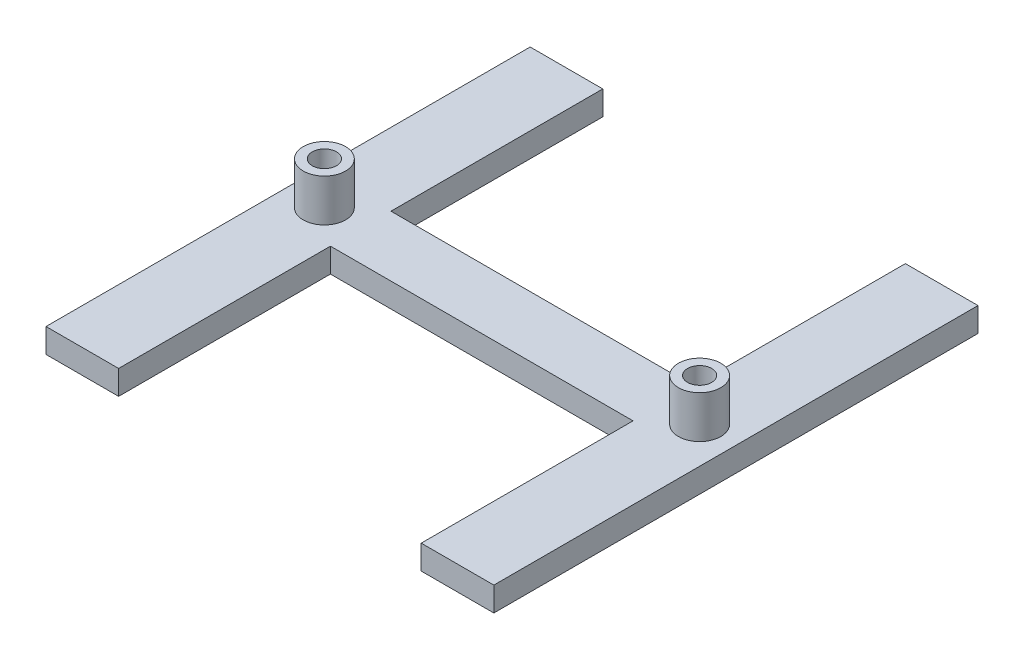
ISO-10303-21;
HEADER;
FILE_DESCRIPTION(('STEP AP214'),'2;1');
FILE_NAME('part.step','',(''),(''),'','','');
FILE_SCHEMA(('AUTOMOTIVE_DESIGN { 1 0 10303 214 1 1 1 1 }'));
ENDSEC;
DATA;
#1=APPLICATION_CONTEXT('core data for automotive mechanical design processes');
#2=APPLICATION_PROTOCOL_DEFINITION('international standard','automotive_design',2000,#1);
#3=PRODUCT_CONTEXT('',#1,'mechanical');
#4=PRODUCT('Part','Part','',(#3));
#5=PRODUCT_RELATED_PRODUCT_CATEGORY('part','',(#4));
#6=PRODUCT_DEFINITION_FORMATION('','',#4);
#7=PRODUCT_DEFINITION_CONTEXT('part definition',#1,'design');
#8=PRODUCT_DEFINITION('design','',#6,#7);
#9=PRODUCT_DEFINITION_SHAPE('','',#8);
#10=(LENGTH_UNIT() NAMED_UNIT(*) SI_UNIT(.MILLI.,.METRE.));
#11=(NAMED_UNIT(*) PLANE_ANGLE_UNIT() SI_UNIT($,.RADIAN.));
#12=(NAMED_UNIT(*) SI_UNIT($,.STERADIAN.) SOLID_ANGLE_UNIT());
#13=UNCERTAINTY_MEASURE_WITH_UNIT(LENGTH_MEASURE(1.E-05),#10,'distance_accuracy_value','');
#14=(GEOMETRIC_REPRESENTATION_CONTEXT(3) GLOBAL_UNCERTAINTY_ASSIGNED_CONTEXT((#13)) GLOBAL_UNIT_ASSIGNED_CONTEXT((#10,
#11,#12)) REPRESENTATION_CONTEXT('',''));
#15=CARTESIAN_POINT('',(0.,0.,0.));
#16=DIRECTION('',(0.,0.,1.));
#17=DIRECTION('',(1.,0.,0.));
#18=AXIS2_PLACEMENT_3D('',#15,#16,#17);
#19=CARTESIAN_POINT('',(-69.7107995038457,4.,0.));
#20=DIRECTION('',(1.,0.,0.));
#21=DIRECTION('',(0.,0.,-1.));
#22=AXIS2_PLACEMENT_3D('',#19,#20,#21);
#23=PLANE('',#22);
#24=DIRECTION('',(0.,0.,1.));
#25=VECTOR('',#24,1.);
#26=CARTESIAN_POINT('',(-69.7107995038457,0.,0.));
#27=LINE('',#26,#25);
#28=CARTESIAN_POINT('',(-69.7107995038457,0.,-123.763400912436));
#29=VERTEX_POINT('',#28);
#30=CARTESIAN_POINT('',(-69.7107995038457,0.,-88.7643319684298));
#31=VERTEX_POINT('',#30);
#32=EDGE_CURVE('E194',#29,#31,#27,.T.);
#33=ORIENTED_EDGE('',*,*,#32,.F.);
#34=DIRECTION('',(0.,-1.,0.));
#35=VECTOR('',#34,1.);
#36=CARTESIAN_POINT('',(-69.7107995038457,4.,-123.763400912436));
#37=LINE('',#36,#35);
#38=CARTESIAN_POINT('',(-69.7107995038457,4.,-123.763400912436));
#39=VERTEX_POINT('',#38);
#40=EDGE_CURVE('E112',#39,#29,#37,.T.);
#41=ORIENTED_EDGE('',*,*,#40,.F.);
#42=DIRECTION('',(0.,0.,1.));
#43=VECTOR('',#42,1.);
#44=CARTESIAN_POINT('',(-69.7107995038457,4.,0.));
#45=LINE('',#44,#43);
#46=CARTESIAN_POINT('',(-69.7107995038457,4.,-88.7643319684298));
#47=VERTEX_POINT('',#46);
#48=EDGE_CURVE('E179',#39,#47,#45,.T.);
#49=ORIENTED_EDGE('',*,*,#48,.T.);
#50=DIRECTION('',(0.,-1.,0.));
#51=VECTOR('',#50,1.);
#52=CARTESIAN_POINT('',(-69.7107995038457,4.,-88.7643319684298));
#53=LINE('',#52,#51);
#54=EDGE_CURVE('E64',#47,#31,#53,.T.);
#55=ORIENTED_EDGE('',*,*,#54,.T.);
#56=EDGE_LOOP('',(#33,#41,#49,#55));
#57=FACE_BOUND('',#56,.T.);
#58=ADVANCED_FACE('F47',(#57),#23,.T.);
#59=CARTESIAN_POINT('',(0.,4.,-123.763400912436));
#60=DIRECTION('',(0.,0.,1.));
#61=DIRECTION('',(1.,0.,0.));
#62=AXIS2_PLACEMENT_3D('',#59,#60,#61);
#63=PLANE('',#62);
#64=DIRECTION('',(-1.,0.,0.));
#65=VECTOR('',#64,1.);
#66=CARTESIAN_POINT('',(0.,0.,-123.763400912436));
#67=LINE('',#66,#65);
#68=CARTESIAN_POINT('',(-81.7107995038457,0.,-123.763400912436));
#69=VERTEX_POINT('',#68);
#70=EDGE_CURVE('E484',#29,#69,#67,.T.);
#71=ORIENTED_EDGE('',*,*,#70,.T.);
#72=DIRECTION('',(0.,-1.,0.));
#73=VECTOR('',#72,1.);
#74=CARTESIAN_POINT('',(-81.7107995038457,4.,-123.763400912436));
#75=LINE('',#74,#73);
#76=CARTESIAN_POINT('',(-81.7107995038457,4.,-123.763400912436));
#77=VERTEX_POINT('',#76);
#78=EDGE_CURVE('E301',#77,#69,#75,.T.);
#79=ORIENTED_EDGE('',*,*,#78,.F.);
#80=DIRECTION('',(-1.,0.,0.));
#81=VECTOR('',#80,1.);
#82=CARTESIAN_POINT('',(0.,4.,-123.763400912436));
#83=LINE('',#82,#81);
#84=EDGE_CURVE('E184',#39,#77,#83,.T.);
#85=ORIENTED_EDGE('',*,*,#84,.F.);
#86=ORIENTED_EDGE('',*,*,#40,.T.);
#87=EDGE_LOOP('',(#71,#79,#85,#86));
#88=FACE_BOUND('',#87,.T.);
#89=ADVANCED_FACE('F49',(#88),#63,.F.);
#90=CARTESIAN_POINT('',(-81.7107995038456,4.,0.));
#91=DIRECTION('',(1.,0.,0.));
#92=DIRECTION('',(0.,0.,-1.));
#93=AXIS2_PLACEMENT_3D('',#90,#91,#92);
#94=PLANE('',#93);
#95=DIRECTION('',(0.,0.,1.));
#96=VECTOR('',#95,1.);
#97=CARTESIAN_POINT('',(-81.7107995038456,0.,0.));
#98=LINE('',#97,#96);
#99=CARTESIAN_POINT('',(-81.7107995038457,0.,-43.7634009124366));
#100=VERTEX_POINT('',#99);
#101=EDGE_CURVE('E479',#69,#100,#98,.T.);
#102=ORIENTED_EDGE('',*,*,#101,.T.);
#103=DIRECTION('',(0.,-1.,0.));
#104=VECTOR('',#103,1.);
#105=CARTESIAN_POINT('',(-81.7107995038457,4.,-43.7634009124366));
#106=LINE('',#105,#104);
#107=CARTESIAN_POINT('',(-81.7107995038457,4.,-43.7634009124366));
#108=VERTEX_POINT('',#107);
#109=EDGE_CURVE('E298',#108,#100,#106,.T.);
#110=ORIENTED_EDGE('',*,*,#109,.F.);
#111=DIRECTION('',(0.,0.,1.));
#112=VECTOR('',#111,1.);
#113=CARTESIAN_POINT('',(-81.7107995038456,4.,0.));
#114=LINE('',#113,#112);
#115=EDGE_CURVE('E182',#77,#108,#114,.T.);
#116=ORIENTED_EDGE('',*,*,#115,.F.);
#117=ORIENTED_EDGE('',*,*,#78,.T.);
#118=EDGE_LOOP('',(#102,#110,#116,#117));
#119=FACE_BOUND('',#118,.T.);
#120=ADVANCED_FACE('F239',(#119),#94,.F.);
#121=CARTESIAN_POINT('',(0.,4.,-43.7634009124366));
#122=DIRECTION('',(0.,0.,-1.));
#123=DIRECTION('',(-1.,0.,0.));
#124=AXIS2_PLACEMENT_3D('',#121,#122,#123);
#125=PLANE('',#124);
#126=DIRECTION('',(1.,0.,0.));
#127=VECTOR('',#126,1.);
#128=CARTESIAN_POINT('',(0.,0.,-43.7634009124366));
#129=LINE('',#128,#127);
#130=CARTESIAN_POINT('',(-69.7107995038457,0.,-43.7634009124366));
#131=VERTEX_POINT('',#130);
#132=EDGE_CURVE('E265',#100,#131,#129,.T.);
#133=ORIENTED_EDGE('',*,*,#132,.T.);
#134=DIRECTION('',(0.,-1.,0.));
#135=VECTOR('',#134,1.);
#136=CARTESIAN_POINT('',(-69.7107995038457,4.,-43.7634009124366));
#137=LINE('',#136,#135);
#138=CARTESIAN_POINT('',(-69.7107995038457,4.,-43.7634009124366));
#139=VERTEX_POINT('',#138);
#140=EDGE_CURVE('E260',#139,#131,#137,.T.);
#141=ORIENTED_EDGE('',*,*,#140,.F.);
#142=DIRECTION('',(1.,0.,0.));
#143=VECTOR('',#142,1.);
#144=CARTESIAN_POINT('',(0.,4.,-43.7634009124366));
#145=LINE('',#144,#143);
#146=EDGE_CURVE('E177',#108,#139,#145,.T.);
#147=ORIENTED_EDGE('',*,*,#146,.F.);
#148=ORIENTED_EDGE('',*,*,#109,.T.);
#149=EDGE_LOOP('',(#133,#141,#147,#148));
#150=FACE_BOUND('',#149,.T.);
#151=ADVANCED_FACE('F245',(#150),#125,.F.);
#152=CARTESIAN_POINT('',(-69.7107995038457,0.,-78.7624698564434));
#153=VERTEX_POINT('',#152);
#154=EDGE_CURVE('E255',#153,#131,#27,.T.);
#155=ORIENTED_EDGE('',*,*,#154,.F.);
#156=DIRECTION('',(0.,-1.,0.));
#157=VECTOR('',#156,1.);
#158=CARTESIAN_POINT('',(-69.7107995038457,4.,-78.7624698564434));
#159=LINE('',#158,#157);
#160=CARTESIAN_POINT('',(-69.7107995038457,4.,-78.7624698564434));
#161=VERTEX_POINT('',#160);
#162=EDGE_CURVE('E257',#161,#153,#159,.T.);
#163=ORIENTED_EDGE('',*,*,#162,.F.);
#164=EDGE_CURVE('E174',#161,#139,#45,.T.);
#165=ORIENTED_EDGE('',*,*,#164,.T.);
#166=ORIENTED_EDGE('',*,*,#140,.T.);
#167=EDGE_LOOP('',(#155,#163,#165,#166));
#168=FACE_BOUND('',#167,.T.);
#169=ADVANCED_FACE('F235',(#168),#23,.T.);
#170=CARTESIAN_POINT('',(0.,4.,-78.7624698564434));
#171=DIRECTION('',(0.,0.,1.));
#172=DIRECTION('',(1.,0.,0.));
#173=AXIS2_PLACEMENT_3D('',#170,#171,#172);
#174=PLANE('',#173);
#175=DIRECTION('',(-1.,0.,0.));
#176=VECTOR('',#175,1.);
#177=CARTESIAN_POINT('',(0.,0.,-78.7624698564434));
#178=LINE('',#177,#176);
#179=CARTESIAN_POINT('',(-19.7107995038457,0.,-78.7624698564434));
#180=VERTEX_POINT('',#179);
#181=EDGE_CURVE('E264',#180,#153,#178,.T.);
#182=ORIENTED_EDGE('',*,*,#181,.F.);
#183=DIRECTION('',(0.,-1.,0.));
#184=VECTOR('',#183,1.);
#185=CARTESIAN_POINT('',(-19.7107995038457,4.,-78.7624698564434));
#186=LINE('',#185,#184);
#187=CARTESIAN_POINT('',(-19.7107995038457,4.,-78.7624698564434));
#188=VERTEX_POINT('',#187);
#189=EDGE_CURVE('E294',#188,#180,#186,.T.);
#190=ORIENTED_EDGE('',*,*,#189,.F.);
#191=DIRECTION('',(-1.,0.,0.));
#192=VECTOR('',#191,1.);
#193=CARTESIAN_POINT('',(0.,4.,-78.7624698564434));
#194=LINE('',#193,#192);
#195=EDGE_CURVE('E169',#188,#161,#194,.T.);
#196=ORIENTED_EDGE('',*,*,#195,.T.);
#197=ORIENTED_EDGE('',*,*,#162,.T.);
#198=EDGE_LOOP('',(#182,#190,#196,#197));
#199=FACE_BOUND('',#198,.T.);
#200=ADVANCED_FACE('F244',(#199),#174,.T.);
#201=CARTESIAN_POINT('',(-19.7107995038457,4.,0.));
#202=DIRECTION('',(1.,0.,0.));
#203=DIRECTION('',(0.,0.,-1.));
#204=AXIS2_PLACEMENT_3D('',#201,#202,#203);
#205=PLANE('',#204);
#206=DIRECTION('',(0.,0.,1.));
#207=VECTOR('',#206,1.);
#208=CARTESIAN_POINT('',(-19.7107995038457,0.,0.));
#209=LINE('',#208,#207);
#210=CARTESIAN_POINT('',(-19.7107995038457,0.,-43.7634009124366));
#211=VERTEX_POINT('',#210);
#212=EDGE_CURVE('E270',#180,#211,#209,.T.);
#213=ORIENTED_EDGE('',*,*,#212,.T.);
#214=DIRECTION('',(0.,-1.,0.));
#215=VECTOR('',#214,1.);
#216=CARTESIAN_POINT('',(-19.7107995038457,4.,-43.7634009124366));
#217=LINE('',#216,#215);
#218=CARTESIAN_POINT('',(-19.7107995038457,4.,-43.7634009124366));
#219=VERTEX_POINT('',#218);
#220=EDGE_CURVE('E291',#219,#211,#217,.T.);
#221=ORIENTED_EDGE('',*,*,#220,.F.);
#222=DIRECTION('',(0.,0.,1.));
#223=VECTOR('',#222,1.);
#224=CARTESIAN_POINT('',(-19.7107995038457,4.,0.));
#225=LINE('',#224,#223);
#226=EDGE_CURVE('E164',#188,#219,#225,.T.);
#227=ORIENTED_EDGE('',*,*,#226,.F.);
#228=ORIENTED_EDGE('',*,*,#189,.T.);
#229=EDGE_LOOP('',(#213,#221,#227,#228));
#230=FACE_BOUND('',#229,.T.);
#231=ADVANCED_FACE('F251',(#230),#205,.F.);
#232=CARTESIAN_POINT('',(0.,4.,-43.7634009124366));
#233=DIRECTION('',(0.,0.,-1.));
#234=DIRECTION('',(-1.,0.,0.));
#235=AXIS2_PLACEMENT_3D('',#232,#233,#234);
#236=PLANE('',#235);
#237=DIRECTION('',(1.,0.,0.));
#238=VECTOR('',#237,1.);
#239=CARTESIAN_POINT('',(0.,0.,-43.7634009124366));
#240=LINE('',#239,#238);
#241=CARTESIAN_POINT('',(-7.71079950384569,0.,-43.7634009124366));
#242=VERTEX_POINT('',#241);
#243=EDGE_CURVE('E272',#211,#242,#240,.T.);
#244=ORIENTED_EDGE('',*,*,#243,.T.);
#245=DIRECTION('',(0.,-1.,0.));
#246=VECTOR('',#245,1.);
#247=CARTESIAN_POINT('',(-7.71079950384569,4.,-43.7634009124366));
#248=LINE('',#247,#246);
#249=CARTESIAN_POINT('',(-7.71079950384569,4.,-43.7634009124366));
#250=VERTEX_POINT('',#249);
#251=EDGE_CURVE('E289',#250,#242,#248,.T.);
#252=ORIENTED_EDGE('',*,*,#251,.F.);
#253=DIRECTION('',(1.,0.,0.));
#254=VECTOR('',#253,1.);
#255=CARTESIAN_POINT('',(0.,4.,-43.7634009124366));
#256=LINE('',#255,#254);
#257=EDGE_CURVE('E168',#219,#250,#256,.T.);
#258=ORIENTED_EDGE('',*,*,#257,.F.);
#259=ORIENTED_EDGE('',*,*,#220,.T.);
#260=EDGE_LOOP('',(#244,#252,#258,#259));
#261=FACE_BOUND('',#260,.T.);
#262=ADVANCED_FACE('F416',(#261),#236,.F.);
#263=CARTESIAN_POINT('',(-7.71079950384568,4.,0.));
#264=DIRECTION('',(1.,0.,0.));
#265=DIRECTION('',(0.,0.,-1.));
#266=AXIS2_PLACEMENT_3D('',#263,#264,#265);
#267=PLANE('',#266);
#268=DIRECTION('',(0.,0.,1.));
#269=VECTOR('',#268,1.);
#270=CARTESIAN_POINT('',(-7.71079950384568,0.,0.));
#271=LINE('',#270,#269);
#272=CARTESIAN_POINT('',(-7.7107995038457,0.,-123.763400912437));
#273=VERTEX_POINT('',#272);
#274=EDGE_CURVE('E280',#273,#242,#271,.T.);
#275=ORIENTED_EDGE('',*,*,#274,.F.);
#276=DIRECTION('',(0.,-1.,0.));
#277=VECTOR('',#276,1.);
#278=CARTESIAN_POINT('',(-7.7107995038457,4.,-123.763400912437));
#279=LINE('',#278,#277);
#280=CARTESIAN_POINT('',(-7.7107995038457,4.,-123.763400912437));
#281=VERTEX_POINT('',#280);
#282=EDGE_CURVE('E159',#281,#273,#279,.T.);
#283=ORIENTED_EDGE('',*,*,#282,.F.);
#284=DIRECTION('',(0.,0.,1.));
#285=VECTOR('',#284,1.);
#286=CARTESIAN_POINT('',(-7.71079950384568,4.,0.));
#287=LINE('',#286,#285);
#288=EDGE_CURVE('E149',#281,#250,#287,.T.);
#289=ORIENTED_EDGE('',*,*,#288,.T.);
#290=ORIENTED_EDGE('',*,*,#251,.T.);
#291=EDGE_LOOP('',(#275,#283,#289,#290));
#292=FACE_BOUND('',#291,.T.);
#293=ADVANCED_FACE('F407',(#292),#267,.T.);
#294=CARTESIAN_POINT('',(0.,4.,-123.763400912437));
#295=DIRECTION('',(0.,0.,1.));
#296=DIRECTION('',(1.,0.,0.));
#297=AXIS2_PLACEMENT_3D('',#294,#295,#296);
#298=PLANE('',#297);
#299=DIRECTION('',(-1.,0.,0.));
#300=VECTOR('',#299,1.);
#301=CARTESIAN_POINT('',(0.,0.,-123.763400912437));
#302=LINE('',#301,#300);
#303=CARTESIAN_POINT('',(-19.7107995038457,0.,-123.763400912437));
#304=VERTEX_POINT('',#303);
#305=EDGE_CURVE('E156',#273,#304,#302,.T.);
#306=ORIENTED_EDGE('',*,*,#305,.T.);
#307=DIRECTION('',(0.,-1.,0.));
#308=VECTOR('',#307,1.);
#309=CARTESIAN_POINT('',(-19.7107995038457,4.,-123.763400912437));
#310=LINE('',#309,#308);
#311=CARTESIAN_POINT('',(-19.7107995038457,4.,-123.763400912437));
#312=VERTEX_POINT('',#311);
#313=EDGE_CURVE('E153',#312,#304,#310,.T.);
#314=ORIENTED_EDGE('',*,*,#313,.F.);
#315=DIRECTION('',(-1.,0.,0.));
#316=VECTOR('',#315,1.);
#317=CARTESIAN_POINT('',(0.,4.,-123.763400912437));
#318=LINE('',#317,#316);
#319=EDGE_CURVE('E141',#281,#312,#318,.T.);
#320=ORIENTED_EDGE('',*,*,#319,.F.);
#321=ORIENTED_EDGE('',*,*,#282,.T.);
#322=EDGE_LOOP('',(#306,#314,#320,#321));
#323=FACE_BOUND('',#322,.T.);
#324=ADVANCED_FACE('F154',(#323),#298,.F.);
#325=CARTESIAN_POINT('',(-19.7107995038457,0.,-88.7643319684298));
#326=VERTEX_POINT('',#325);
#327=EDGE_CURVE('E274',#304,#326,#209,.T.);
#328=ORIENTED_EDGE('',*,*,#327,.T.);
#329=DIRECTION('',(0.,-1.,0.));
#330=VECTOR('',#329,1.);
#331=CARTESIAN_POINT('',(-19.7107995038457,4.,-88.7643319684298));
#332=LINE('',#331,#330);
#333=CARTESIAN_POINT('',(-19.7107995038457,4.,-88.7643319684298));
#334=VERTEX_POINT('',#333);
#335=EDGE_CURVE('E103',#334,#326,#332,.T.);
#336=ORIENTED_EDGE('',*,*,#335,.F.);
#337=EDGE_CURVE('E147',#312,#334,#225,.T.);
#338=ORIENTED_EDGE('',*,*,#337,.F.);
#339=ORIENTED_EDGE('',*,*,#313,.T.);
#340=EDGE_LOOP('',(#328,#336,#338,#339));
#341=FACE_BOUND('',#340,.T.);
#342=ADVANCED_FACE('F161',(#341),#205,.F.);
#343=CARTESIAN_POINT('',(0.,4.,-88.7643319684298));
#344=DIRECTION('',(0.,0.,-1.));
#345=DIRECTION('',(-1.,0.,0.));
#346=AXIS2_PLACEMENT_3D('',#343,#344,#345);
#347=PLANE('',#346);
#348=DIRECTION('',(1.,0.,0.));
#349=VECTOR('',#348,1.);
#350=CARTESIAN_POINT('',(0.,0.,-88.7643319684298));
#351=LINE('',#350,#349);
#352=EDGE_CURVE('E186',#31,#326,#351,.T.);
#353=ORIENTED_EDGE('',*,*,#352,.F.);
#354=ORIENTED_EDGE('',*,*,#54,.F.);
#355=DIRECTION('',(1.,0.,0.));
#356=VECTOR('',#355,1.);
#357=CARTESIAN_POINT('',(0.,4.,-88.7643319684298));
#358=LINE('',#357,#356);
#359=EDGE_CURVE('E162',#47,#334,#358,.T.);
#360=ORIENTED_EDGE('',*,*,#359,.T.);
#361=ORIENTED_EDGE('',*,*,#335,.T.);
#362=EDGE_LOOP('',(#353,#354,#360,#361));
#363=FACE_BOUND('',#362,.T.);
#364=ADVANCED_FACE('F212',(#363),#347,.T.);
#365=CARTESIAN_POINT('',(0.,4.,0.));
#366=DIRECTION('',(0.,1.,0.));
#367=DIRECTION('',(0.,0.,1.));
#368=AXIS2_PLACEMENT_3D('',#365,#366,#367);
#369=PLANE('',#368);
#370=CARTESIAN_POINT('',(-13.7107995038457,4.,-83.7634009124364));
#371=DIRECTION('',(0.,1.,0.));
#372=DIRECTION('',(0.,0.,1.));
#373=AXIS2_PLACEMENT_3D('',#370,#371,#372);
#374=CIRCLE('',#373,3.5);
#375=CARTESIAN_POINT('',(-13.7107995038457,4.,-80.2634009124364));
#376=VERTEX_POINT('',#375);
#377=EDGE_CURVE('E200',#376,#376,#374,.T.);
#378=ORIENTED_EDGE('',*,*,#377,.F.);
#379=EDGE_LOOP('',(#378));
#380=FACE_BOUND('',#379,.T.);
#381=CARTESIAN_POINT('',(-75.7107995038456,4.,-83.7634009124364));
#382=DIRECTION('',(0.,1.,0.));
#383=DIRECTION('',(0.,0.,1.));
#384=AXIS2_PLACEMENT_3D('',#381,#382,#383);
#385=CIRCLE('',#384,3.50000000000001);
#386=CARTESIAN_POINT('',(-75.7107995038456,4.,-80.2634009124364));
#387=VERTEX_POINT('',#386);
#388=EDGE_CURVE('E187',#387,#387,#385,.T.);
#389=ORIENTED_EDGE('',*,*,#388,.F.);
#390=EDGE_LOOP('',(#389));
#391=FACE_BOUND('',#390,.T.);
#392=ORIENTED_EDGE('',*,*,#48,.F.);
#393=ORIENTED_EDGE('',*,*,#84,.T.);
#394=ORIENTED_EDGE('',*,*,#115,.T.);
#395=ORIENTED_EDGE('',*,*,#146,.T.);
#396=ORIENTED_EDGE('',*,*,#164,.F.);
#397=ORIENTED_EDGE('',*,*,#195,.F.);
#398=ORIENTED_EDGE('',*,*,#226,.T.);
#399=ORIENTED_EDGE('',*,*,#257,.T.);
#400=ORIENTED_EDGE('',*,*,#288,.F.);
#401=ORIENTED_EDGE('',*,*,#319,.T.);
#402=ORIENTED_EDGE('',*,*,#337,.T.);
#403=ORIENTED_EDGE('',*,*,#359,.F.);
#404=EDGE_LOOP('',(#392,#393,#394,#395,#396,#397,#398,#399,#400,#401,#402,#403));
#405=FACE_BOUND('',#404,.T.);
#406=ADVANCED_FACE('F144',(#380,#391,#405),#369,.T.);
#407=CARTESIAN_POINT('',(0.,0.,0.));
#408=DIRECTION('',(0.,1.,0.));
#409=DIRECTION('',(0.,0.,1.));
#410=AXIS2_PLACEMENT_3D('',#407,#408,#409);
#411=PLANE('',#410);
#412=ORIENTED_EDGE('',*,*,#32,.T.);
#413=ORIENTED_EDGE('',*,*,#352,.T.);
#414=ORIENTED_EDGE('',*,*,#327,.F.);
#415=ORIENTED_EDGE('',*,*,#305,.F.);
#416=ORIENTED_EDGE('',*,*,#274,.T.);
#417=ORIENTED_EDGE('',*,*,#243,.F.);
#418=ORIENTED_EDGE('',*,*,#212,.F.);
#419=ORIENTED_EDGE('',*,*,#181,.T.);
#420=ORIENTED_EDGE('',*,*,#154,.T.);
#421=ORIENTED_EDGE('',*,*,#132,.F.);
#422=ORIENTED_EDGE('',*,*,#101,.F.);
#423=ORIENTED_EDGE('',*,*,#70,.F.);
#424=EDGE_LOOP('',(#412,#413,#414,#415,#416,#417,#418,#419,#420,#421,#422,#423));
#425=FACE_BOUND('',#424,.T.);
#426=ADVANCED_FACE('F211',(#425),#411,.F.);
#427=CARTESIAN_POINT('',(-75.7107995038456,11.,-83.7634009124364));
#428=DIRECTION('',(0.,1.,0.));
#429=DIRECTION('',(0.,0.,1.));
#430=AXIS2_PLACEMENT_3D('',#427,#428,#429);
#431=PLANE('',#430);
#432=CARTESIAN_POINT('',(-75.7107995038456,11.,-83.7634009124364));
#433=DIRECTION('',(0.,1.,0.));
#434=DIRECTION('',(0.,0.,1.));
#435=AXIS2_PLACEMENT_3D('',#432,#433,#434);
#436=CIRCLE('',#435,3.50000000000001);
#437=CARTESIAN_POINT('',(-75.7107995038456,11.,-80.2634009124364));
#438=VERTEX_POINT('',#437);
#439=EDGE_CURVE('E190',#438,#438,#436,.T.);
#440=ORIENTED_EDGE('',*,*,#439,.T.);
#441=EDGE_LOOP('',(#440));
#442=FACE_BOUND('',#441,.T.);
#443=CARTESIAN_POINT('',(-75.7107995038456,11.,-83.7634009124364));
#444=DIRECTION('',(0.,1.,0.));
#445=DIRECTION('',(0.,0.,1.));
#446=AXIS2_PLACEMENT_3D('',#443,#444,#445);
#447=CIRCLE('',#446,2.);
#448=CARTESIAN_POINT('',(-75.7107995038456,11.,-81.7634009124364));
#449=VERTEX_POINT('',#448);
#450=EDGE_CURVE('E191',#449,#449,#447,.T.);
#451=ORIENTED_EDGE('',*,*,#450,.F.);
#452=EDGE_LOOP('',(#451));
#453=FACE_BOUND('',#452,.T.);
#454=ADVANCED_FACE('F221',(#442,#453),#431,.T.);
#455=CARTESIAN_POINT('',(-75.7107995038456,11.,-83.7634009124364));
#456=DIRECTION('',(0.,-1.,0.));
#457=DIRECTION('',(0.,0.,-1.));
#458=AXIS2_PLACEMENT_3D('',#455,#456,#457);
#459=CYLINDRICAL_SURFACE('',#458,3.50000000000001);
#460=ORIENTED_EDGE('',*,*,#439,.F.);
#461=EDGE_LOOP('',(#460));
#462=FACE_BOUND('',#461,.T.);
#463=ORIENTED_EDGE('',*,*,#388,.T.);
#464=EDGE_LOOP('',(#463));
#465=FACE_BOUND('',#464,.T.);
#466=ADVANCED_FACE('F218',(#462,#465),#459,.T.);
#467=CARTESIAN_POINT('',(-75.7107995038456,11.,-83.7634009124364));
#468=DIRECTION('',(0.,-1.,0.));
#469=DIRECTION('',(0.,0.,-1.));
#470=AXIS2_PLACEMENT_3D('',#467,#468,#469);
#471=CYLINDRICAL_SURFACE('',#470,2.);
#472=ORIENTED_EDGE('',*,*,#450,.T.);
#473=EDGE_LOOP('',(#472));
#474=FACE_BOUND('',#473,.T.);
#475=CARTESIAN_POINT('',(-75.7107995038456,4.,-83.7634009124364));
#476=DIRECTION('',(0.,1.,0.));
#477=DIRECTION('',(0.,0.,1.));
#478=AXIS2_PLACEMENT_3D('',#475,#476,#477);
#479=CIRCLE('',#478,2.);
#480=CARTESIAN_POINT('',(-75.7107995038456,4.,-81.7634009124364));
#481=VERTEX_POINT('',#480);
#482=EDGE_CURVE('E56',#481,#481,#479,.F.);
#483=ORIENTED_EDGE('',*,*,#482,.T.);
#484=EDGE_LOOP('',(#483));
#485=FACE_BOUND('',#484,.T.);
#486=ADVANCED_FACE('F220',(#474,#485),#471,.F.);
#487=ORIENTED_EDGE('',*,*,#482,.F.);
#488=EDGE_LOOP('',(#487));
#489=FACE_BOUND('',#488,.T.);
#490=ADVANCED_FACE('F215',(#489),#369,.T.);
#491=CARTESIAN_POINT('',(-13.7107995038457,11.,-83.7634009124364));
#492=DIRECTION('',(0.,1.,0.));
#493=DIRECTION('',(0.,0.,1.));
#494=AXIS2_PLACEMENT_3D('',#491,#492,#493);
#495=PLANE('',#494);
#496=CARTESIAN_POINT('',(-13.7107995038457,11.,-83.7634009124364));
#497=DIRECTION('',(0.,1.,0.));
#498=DIRECTION('',(0.,0.,1.));
#499=AXIS2_PLACEMENT_3D('',#496,#497,#498);
#500=CIRCLE('',#499,3.5);
#501=CARTESIAN_POINT('',(-13.7107995038457,11.,-80.2634009124364));
#502=VERTEX_POINT('',#501);
#503=EDGE_CURVE('E201',#502,#502,#500,.T.);
#504=ORIENTED_EDGE('',*,*,#503,.T.);
#505=EDGE_LOOP('',(#504));
#506=FACE_BOUND('',#505,.T.);
#507=CARTESIAN_POINT('',(-13.7107995038457,11.,-83.7634009124364));
#508=DIRECTION('',(0.,1.,0.));
#509=DIRECTION('',(0.,0.,1.));
#510=AXIS2_PLACEMENT_3D('',#507,#508,#509);
#511=CIRCLE('',#510,2.);
#512=CARTESIAN_POINT('',(-13.7107995038457,11.,-81.7634009124364));
#513=VERTEX_POINT('',#512);
#514=EDGE_CURVE('E197',#513,#513,#511,.T.);
#515=ORIENTED_EDGE('',*,*,#514,.F.);
#516=EDGE_LOOP('',(#515));
#517=FACE_BOUND('',#516,.T.);
#518=ADVANCED_FACE('F309',(#506,#517),#495,.T.);
#519=CARTESIAN_POINT('',(-13.7107995038457,11.,-83.7634009124364));
#520=DIRECTION('',(0.,-1.,0.));
#521=DIRECTION('',(0.,0.,-1.));
#522=AXIS2_PLACEMENT_3D('',#519,#520,#521);
#523=CYLINDRICAL_SURFACE('',#522,3.5);
#524=ORIENTED_EDGE('',*,*,#503,.F.);
#525=EDGE_LOOP('',(#524));
#526=FACE_BOUND('',#525,.T.);
#527=ORIENTED_EDGE('',*,*,#377,.T.);
#528=EDGE_LOOP('',(#527));
#529=FACE_BOUND('',#528,.T.);
#530=ADVANCED_FACE('F207',(#526,#529),#523,.T.);
#531=CARTESIAN_POINT('',(-13.7107995038457,11.,-83.7634009124364));
#532=DIRECTION('',(0.,-1.,0.));
#533=DIRECTION('',(0.,0.,-1.));
#534=AXIS2_PLACEMENT_3D('',#531,#532,#533);
#535=CYLINDRICAL_SURFACE('',#534,2.);
#536=ORIENTED_EDGE('',*,*,#514,.T.);
#537=EDGE_LOOP('',(#536));
#538=FACE_BOUND('',#537,.T.);
#539=CARTESIAN_POINT('',(-13.7107995038457,4.,-83.7634009124364));
#540=DIRECTION('',(0.,1.,0.));
#541=DIRECTION('',(0.,0.,1.));
#542=AXIS2_PLACEMENT_3D('',#539,#540,#541);
#543=CIRCLE('',#542,2.);
#544=CARTESIAN_POINT('',(-13.7107995038457,4.,-81.7634009124364));
#545=VERTEX_POINT('',#544);
#546=EDGE_CURVE('E12',#545,#545,#543,.F.);
#547=ORIENTED_EDGE('',*,*,#546,.T.);
#548=EDGE_LOOP('',(#547));
#549=FACE_BOUND('',#548,.T.);
#550=ADVANCED_FACE('F317',(#538,#549),#535,.F.);
#551=ORIENTED_EDGE('',*,*,#546,.F.);
#552=EDGE_LOOP('',(#551));
#553=FACE_BOUND('',#552,.T.);
#554=ADVANCED_FACE('F214',(#553),#369,.T.);
#555=CLOSED_SHELL('',(#58,#89,#120,#151,#169,#200,#231,#262,#293,#324,#342,#364,#406,#426,#454,
#466,#486,#490,#518,#530,#550,#554));
#556=MANIFOLD_SOLID_BREP('B2',#555);
#557=ADVANCED_BREP_SHAPE_REPRESENTATION('',(#18,#556),#14);
#558=SHAPE_DEFINITION_REPRESENTATION(#9,#557);
ENDSEC;
END-ISO-10303-21;
